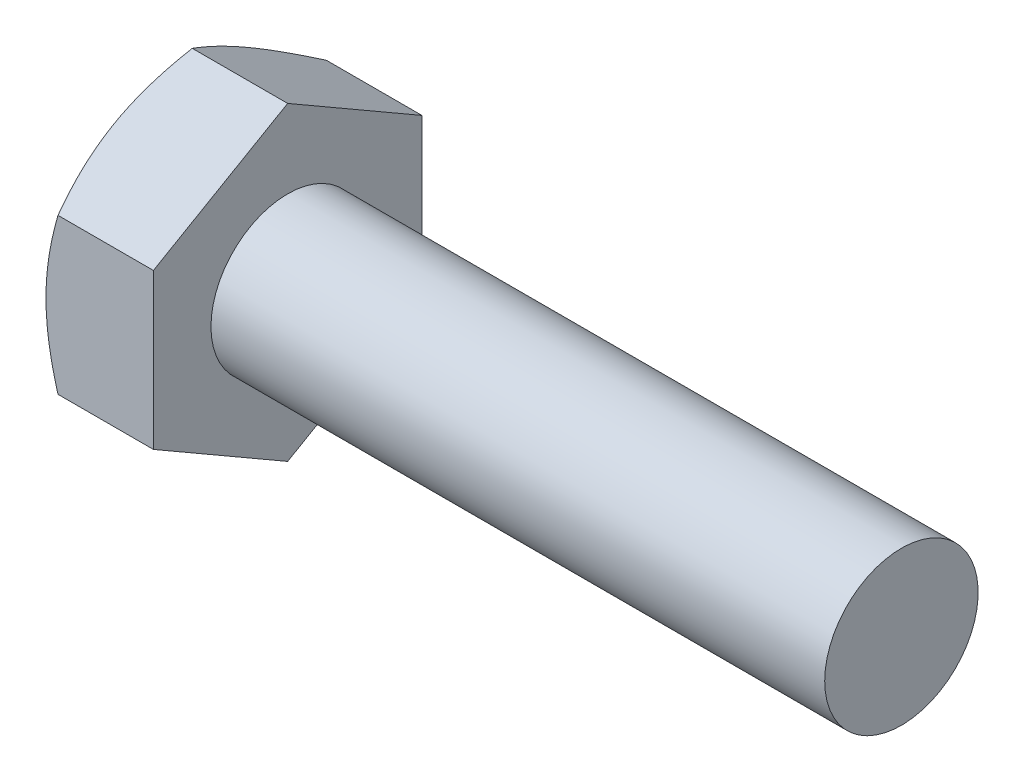
ISO-10303-21;
HEADER;
FILE_DESCRIPTION(('STEP AP214'),'2;1');
FILE_NAME('part.step','',(''),(''),'','','');
FILE_SCHEMA(('AUTOMOTIVE_DESIGN { 1 0 10303 214 1 1 1 1 }'));
ENDSEC;
DATA;
#1=APPLICATION_CONTEXT('core data for automotive mechanical design processes');
#2=APPLICATION_PROTOCOL_DEFINITION('international standard','automotive_design',2000,#1);
#3=PRODUCT_CONTEXT('',#1,'mechanical');
#4=PRODUCT('Part','Part','',(#3));
#5=PRODUCT_RELATED_PRODUCT_CATEGORY('part','',(#4));
#6=PRODUCT_DEFINITION_FORMATION('','',#4);
#7=PRODUCT_DEFINITION_CONTEXT('part definition',#1,'design');
#8=PRODUCT_DEFINITION('design','',#6,#7);
#9=PRODUCT_DEFINITION_SHAPE('','',#8);
#10=(LENGTH_UNIT() NAMED_UNIT(*) SI_UNIT(.MILLI.,.METRE.));
#11=(NAMED_UNIT(*) PLANE_ANGLE_UNIT() SI_UNIT($,.RADIAN.));
#12=(NAMED_UNIT(*) SI_UNIT($,.STERADIAN.) SOLID_ANGLE_UNIT());
#13=UNCERTAINTY_MEASURE_WITH_UNIT(LENGTH_MEASURE(1.E-05),#10,'distance_accuracy_value','');
#14=(GEOMETRIC_REPRESENTATION_CONTEXT(3) GLOBAL_UNCERTAINTY_ASSIGNED_CONTEXT((#13)) GLOBAL_UNIT_ASSIGNED_CONTEXT((#10,
#11,#12)) REPRESENTATION_CONTEXT('',''));
#15=CARTESIAN_POINT('',(0.,0.,0.));
#16=DIRECTION('',(0.,0.,1.));
#17=DIRECTION('',(1.,0.,0.));
#18=AXIS2_PLACEMENT_3D('',#15,#16,#17);
#19=CARTESIAN_POINT('',(2.8,2.02072594216369,-3.5));
#20=DIRECTION('',(0.,-0.866025403784438,0.500000000000001));
#21=DIRECTION('',(0.,-0.500000000000001,-0.866025403784438));
#22=AXIS2_PLACEMENT_3D('',#19,#20,#21);
#23=PLANE('',#22);
#24=CARTESIAN_POINT('',(0.312674060693371,4.04156735438122,0.000200000000000014));
#25=CARTESIAN_POINT('',(0.261385788989984,3.9527667384984,-0.15360717845245));
#26=CARTESIAN_POINT('',(0.214740953816197,3.86319960126198,-0.308742010834424));
#27=CARTESIAN_POINT('',(0.133321875533349,3.68251437287562,-0.621698006576781));
#28=CARTESIAN_POINT('',(0.0985764355845617,3.59139307116725,-0.779524730787495));
#29=CARTESIAN_POINT('',(0.0444900271828363,3.41027974688034,-1.09322221038013));
#30=CARTESIAN_POINT('',(0.0247890862603818,3.32031559103708,-1.24904469916069));
#31=CARTESIAN_POINT('',(0.00127013273725428,3.13996396008052,-1.56142288720537));
#32=CARTESIAN_POINT('',(-0.00256735545443524,3.04957714051106,-1.71797745103423));
#33=CARTESIAN_POINT('',(0.00541530187697692,2.88068384499777,-2.01050921992099));
#34=CARTESIAN_POINT('',(0.0152754340696064,2.80215208834114,-2.14653021245791));
#35=CARTESIAN_POINT('',(0.0465264668994025,2.64560020969753,-2.41768602028899));
#36=CARTESIAN_POINT('',(0.0679280432857969,2.56758062920649,-2.55281989768468));
#37=CARTESIAN_POINT('',(0.121430407880575,2.41070596159678,-2.82453479240518));
#38=CARTESIAN_POINT('',(0.153757994445085,2.33187072981463,-2.96108141927834));
#39=CARTESIAN_POINT('',(0.227128933807992,2.17537608630783,-3.2321380929445));
#40=CARTESIAN_POINT('',(0.268155046569864,2.09771466960098,-3.36665161246854));
#41=CARTESIAN_POINT('',(0.312674060693368,2.02061047210985,-3.5002));
#42=B_SPLINE_CURVE_WITH_KNOTS('',3,(#24,#25,#26,#27,#28,#29,#30,#31,#32,#33,#34,#35,#36,#37,#38,
#39,#40,#41),.UNSPECIFIED.,.F.,.F.,(4,2,2,2,2,2,2,2,4),(0.,0.554793832886254,1.11092123814984,
1.65328467083219,2.19498204478403,2.6666513085086,3.13875761298267,3.6213361260051,
4.10296698719187),.UNSPECIFIED.);
#43=CARTESIAN_POINT('',(0.312607391169643,4.04145188432738,0.));
#44=VERTEX_POINT('',#43);
#45=CARTESIAN_POINT('',(0.,3.03108891324553,-1.75));
#46=VERTEX_POINT('',#45);
#47=EDGE_CURVE('E52',#44,#46,#42,.T.);
#48=ORIENTED_EDGE('',*,*,#47,.F.);
#49=DIRECTION('',(-1.,0.,0.));
#50=VECTOR('',#49,1.);
#51=CARTESIAN_POINT('',(2.8,4.04145188432738,0.));
#52=LINE('',#51,#50);
#53=CARTESIAN_POINT('',(2.8,4.04145188432738,0.));
#54=VERTEX_POINT('',#53);
#55=EDGE_CURVE('E148',#54,#44,#52,.T.);
#56=ORIENTED_EDGE('',*,*,#55,.F.);
#57=DIRECTION('',(0.,0.500000000000001,0.866025403784438));
#58=VECTOR('',#57,1.);
#59=CARTESIAN_POINT('',(2.8,2.02072594216369,-3.5));
#60=LINE('',#59,#58);
#61=CARTESIAN_POINT('',(2.8,2.02072594216369,-3.5));
#62=VERTEX_POINT('',#61);
#63=EDGE_CURVE('E233',#62,#54,#60,.T.);
#64=ORIENTED_EDGE('',*,*,#63,.F.);
#65=DIRECTION('',(-1.,0.,0.));
#66=VECTOR('',#65,1.);
#67=CARTESIAN_POINT('',(2.8,2.02072594216369,-3.5));
#68=LINE('',#67,#66);
#69=CARTESIAN_POINT('',(0.31260739116964,2.02072594216369,-3.5));
#70=VERTEX_POINT('',#69);
#71=EDGE_CURVE('E136',#62,#70,#68,.T.);
#72=ORIENTED_EDGE('',*,*,#71,.T.);
#73=EDGE_CURVE('E130',#46,#70,#42,.T.);
#74=ORIENTED_EDGE('',*,*,#73,.F.);
#75=EDGE_LOOP('',(#48,#56,#64,#72,#74));
#76=FACE_BOUND('',#75,.T.);
#77=ADVANCED_FACE('F36',(#76),#23,.F.);
#78=CARTESIAN_POINT('',(2.8,4.04145188432738,0.));
#79=DIRECTION('',(0.,-0.866025403784438,-0.500000000000001));
#80=DIRECTION('',(0.,0.500000000000001,-0.866025403784438));
#81=AXIS2_PLACEMENT_3D('',#78,#79,#80);
#82=PLANE('',#81);
#83=CARTESIAN_POINT('',(0.312674060693368,2.02061047210985,3.5002));
#84=CARTESIAN_POINT('',(0.261385788989981,2.10941108799267,3.34639282154755));
#85=CARTESIAN_POINT('',(0.214740953816194,2.19897822522909,3.19125798916558));
#86=CARTESIAN_POINT('',(0.133321875533347,2.37966345361545,2.87830199342322));
#87=CARTESIAN_POINT('',(0.0985764355845602,2.47078475532382,2.72047526921251));
#88=CARTESIAN_POINT('',(0.0444900271828353,2.65189807961073,2.40677778961987));
#89=CARTESIAN_POINT('',(0.0247890862603807,2.74186223545399,2.25095530083931));
#90=CARTESIAN_POINT('',(0.00127013273725387,2.92221386641055,1.93857711279463));
#91=CARTESIAN_POINT('',(-0.00256735545443493,3.01260068598001,1.78202254896577));
#92=CARTESIAN_POINT('',(0.00541530187697771,3.1814939814933,1.48949078007901));
#93=CARTESIAN_POINT('',(0.0152754340696071,3.26002573814993,1.3534697875421));
#94=CARTESIAN_POINT('',(0.0465264668994036,3.41657761679354,1.08231397971101));
#95=CARTESIAN_POINT('',(0.0679280432857984,3.49459719728458,0.947180102315318));
#96=CARTESIAN_POINT('',(0.121430407880577,3.65147186489429,0.675465207594817));
#97=CARTESIAN_POINT('',(0.153757994445087,3.73030709667644,0.538918580721665));
#98=CARTESIAN_POINT('',(0.227128933807994,3.88680174018324,0.267861907055499));
#99=CARTESIAN_POINT('',(0.268155046569867,3.96446315689009,0.133348387531464));
#100=CARTESIAN_POINT('',(0.312674060693371,4.04156735438122,-0.000200000000000172));
#101=B_SPLINE_CURVE_WITH_KNOTS('',3,(#83,#84,#85,#86,#87,#88,#89,#90,#91,#92,#93,#94,#95,#96,
#97,#98,#99,#100),.UNSPECIFIED.,.F.,.F.,(4,2,2,2,2,2,2,2,4),(0.,0.554793832886253,
1.11092123814984,1.65328467083219,2.19498204478403,2.6666513085086,3.13875761298267,
3.6213361260051,4.10296698719187),.UNSPECIFIED.);
#102=CARTESIAN_POINT('',(0.31260739116964,2.02072594216369,3.5));
#103=VERTEX_POINT('',#102);
#104=CARTESIAN_POINT('',(0.,3.03108891324553,1.75));
#105=VERTEX_POINT('',#104);
#106=EDGE_CURVE('E59',#103,#105,#101,.T.);
#107=ORIENTED_EDGE('',*,*,#106,.F.);
#108=DIRECTION('',(-1.,0.,0.));
#109=VECTOR('',#108,1.);
#110=CARTESIAN_POINT('',(2.8,2.02072594216369,3.5));
#111=LINE('',#110,#109);
#112=CARTESIAN_POINT('',(2.8,2.02072594216369,3.5));
#113=VERTEX_POINT('',#112);
#114=EDGE_CURVE('E146',#113,#103,#111,.T.);
#115=ORIENTED_EDGE('',*,*,#114,.F.);
#116=DIRECTION('',(0.,-0.500000000000001,0.866025403784438));
#117=VECTOR('',#116,1.);
#118=CARTESIAN_POINT('',(2.8,4.04145188432738,0.));
#119=LINE('',#118,#117);
#120=EDGE_CURVE('E231',#54,#113,#119,.T.);
#121=ORIENTED_EDGE('',*,*,#120,.F.);
#122=ORIENTED_EDGE('',*,*,#55,.T.);
#123=EDGE_CURVE('E163',#105,#44,#101,.T.);
#124=ORIENTED_EDGE('',*,*,#123,.F.);
#125=EDGE_LOOP('',(#107,#115,#121,#122,#124));
#126=FACE_BOUND('',#125,.T.);
#127=ADVANCED_FACE('F169',(#126),#82,.F.);
#128=CARTESIAN_POINT('',(2.8,2.02072594216369,3.5));
#129=DIRECTION('',(0.,0.,-1.));
#130=DIRECTION('',(0.,1.,0.));
#131=AXIS2_PLACEMENT_3D('',#128,#129,#130);
#132=PLANE('',#131);
#133=CARTESIAN_POINT('',(1.74876972324083,-5.51155991662166,3.5));
#134=CARTESIAN_POINT('',(1.67392336064349,-5.35795146497442,3.5));
#135=CARTESIAN_POINT('',(1.59977092634846,-5.20399921327066,3.5));
#136=CARTESIAN_POINT('',(1.45324265223557,-4.89522455167778,3.5));
#137=CARTESIAN_POINT('',(1.38086707701141,-4.74040201636207,3.5));
#138=CARTESIAN_POINT('',(1.23793493399994,-4.42894615294238,3.5));
#139=CARTESIAN_POINT('',(1.16738971193149,-4.27230760071021,3.5));
#140=CARTESIAN_POINT('',(1.02907715201446,-3.95781335407224,3.5));
#141=CARTESIAN_POINT('',(0.961309688205795,-3.79995771524289,3.5));
#142=CARTESIAN_POINT('',(0.82704925806826,-3.47741113342679,3.5));
#143=CARTESIAN_POINT('',(0.760677040301388,-3.31266966191409,3.5));
#144=CARTESIAN_POINT('',(0.632756391222596,-2.9812905533435,3.5));
#145=CARTESIAN_POINT('',(0.571208489240966,-2.81465271050396,3.5));
#146=CARTESIAN_POINT('',(0.454490935593627,-2.47950135142083,3.5));
#147=CARTESIAN_POINT('',(0.399309072522244,-2.31099212961238,3.5));
#148=CARTESIAN_POINT('',(0.297038623207365,-1.97155788075462,3.5));
#149=CARTESIAN_POINT('',(0.24994757546108,-1.80063360563482,3.5));
#150=CARTESIAN_POINT('',(0.166312731904444,-1.4572176944235,3.5));
#151=CARTESIAN_POINT('',(0.129709932809728,-1.2847406913243,3.5));
#152=CARTESIAN_POINT('',(0.0690664437905964,-0.937557024710308,3.5));
#153=CARTESIAN_POINT('',(0.0450243877823819,-0.762850605780832,3.5));
#154=CARTESIAN_POINT('',(0.0117307990577601,-0.414396255839315,3.5));
#155=CARTESIAN_POINT('',(0.00228260576824184,-0.240667591359053,3.5));
#156=CARTESIAN_POINT('',(-0.00154556657178785,0.106974361978124,3.5));
#157=CARTESIAN_POINT('',(0.00407467653682711,0.280887653519271,3.5));
#158=CARTESIAN_POINT('',(0.0258160056757244,0.573677732069631,3.5));
#159=CARTESIAN_POINT('',(0.0381294865222875,0.692856455403483,3.5));
#160=CARTESIAN_POINT('',(0.0691104276210837,0.930390572672188,3.5));
#161=CARTESIAN_POINT('',(0.0877786805228844,1.04874586201749,3.5));
#162=CARTESIAN_POINT('',(0.152339395828374,1.40238821330866,3.5));
#163=CARTESIAN_POINT('',(0.206777964761844,1.63613518289363,3.5));
#164=CARTESIAN_POINT('',(0.301818253779738,1.98584040996061,3.5));
#165=CARTESIAN_POINT('',(0.336200478121237,2.10359260845123,3.5));
#166=CARTESIAN_POINT('',(0.408694226179533,2.33795453185626,3.5));
#167=CARTESIAN_POINT('',(0.446805778664191,2.45456424794998,3.5));
#168=CARTESIAN_POINT('',(0.526133501179596,2.68667648799219,3.5));
#169=CARTESIAN_POINT('',(0.567348797905205,2.80217931315366,3.5));
#170=CARTESIAN_POINT('',(0.652383319257558,3.03221622488003,3.5));
#171=CARTESIAN_POINT('',(0.696202484064565,3.14675033363066,3.5));
#172=CARTESIAN_POINT('',(0.817586420524255,3.45518824791986,3.5));
#173=CARTESIAN_POINT('',(0.897216284270027,3.64827858653488,3.5));
#174=CARTESIAN_POINT('',(1.06116121789353,4.03246734047174,3.5));
#175=CARTESIAN_POINT('',(1.14547680977311,4.22356553103577,3.5));
#176=CARTESIAN_POINT('',(1.31768022516433,4.60422080385888,3.5));
#177=CARTESIAN_POINT('',(1.40556928969842,4.79377732281037,3.5));
#178=CARTESIAN_POINT('',(1.5840729434937,5.17160543290686,3.5));
#179=CARTESIAN_POINT('',(1.67468761675268,5.3598769842319,3.5));
#180=CARTESIAN_POINT('',(1.85818750995008,5.73567568482784,3.5));
#181=CARTESIAN_POINT('',(1.95107608308063,5.92320119337957,3.5));
#182=CARTESIAN_POINT('',(2.13854805180964,6.29740401627919,3.5));
#183=CARTESIAN_POINT('',(2.23313146548459,6.48408132155384,3.5));
#184=CARTESIAN_POINT('',(2.51886265052555,7.04299370869452,3.5));
#185=CARTESIAN_POINT('',(2.71203324279836,7.41419418882236,3.5));
#186=CARTESIAN_POINT('',(3.08131090922904,8.11545297659332,3.5));
#187=CARTESIAN_POINT('',(3.257056800529,8.44570240889787,3.5));
#188=CARTESIAN_POINT('',(3.61066708174042,9.10509095555402,3.5));
#189=CARTESIAN_POINT('',(3.78853160254258,9.43422999967597,3.5));
#190=CARTESIAN_POINT('',(4.14522643287858,10.0905480477554,3.5));
#191=CARTESIAN_POINT('',(4.32405147354835,10.4177299197431,3.5));
#192=CARTESIAN_POINT('',(4.68290305461308,11.0714005829853,3.5));
#193=CARTESIAN_POINT('',(4.86292949853349,11.3978894271807,3.5));
#194=CARTESIAN_POINT('',(5.04339321876768,11.7241348746726,3.5));
#195=B_SPLINE_CURVE_WITH_KNOTS('',3,(#133,#134,#135,#136,#137,#138,#139,#140,#141,#142,#143,
#144,#145,#146,#147,#148,#149,#150,#151,#152,#153,#154,#155,#156,#157,#158,#159,#160,#161,#162,
#163,#164,#165,#166,#167,#168,#169,#170,#171,#172,#173,#174,#175,#176,#177,#178,#179,#180,#181,
#182,#183,#184,#185,#186,#187,#188,#189,#190,#191,#192,#193,#194),.UNSPECIFIED.,.F.,.F.,(4,2,2,
2,2,2,2,2,2,2,2,2,2,2,2,2,2,2,2,2,2,2,2,2,2,2,2,2,2,2,4),(0.,0.512624455455558,1.02532478887103,
1.54067716699584,2.05600615007007,2.58877526866933,3.12160276180877,3.65339055960882,
4.18501628177853,4.71358975001966,5.24210571958898,5.76343550668358,6.28477297996432,
6.64403977825952,7.00335140539848,7.72232402673615,8.09029790450666,8.45827462103385,
8.82614818350625,9.19401329793224,9.82051720822946,10.4470910530887,11.0738843896344,
11.7006970625238,12.3284975533834,12.9563047441025,14.211635085947,15.33392926628,
16.4562931462709,17.574877685398,18.6933734561263),.UNSPECIFIED.);
#196=CARTESIAN_POINT('',(0.31260739116964,-2.02072594216368,3.5));
#197=VERTEX_POINT('',#196);
#198=CARTESIAN_POINT('',(0.,0.,3.5));
#199=VERTEX_POINT('',#198);
#200=EDGE_CURVE('E240',#197,#199,#195,.T.);
#201=ORIENTED_EDGE('',*,*,#200,.F.);
#202=DIRECTION('',(-1.,0.,0.));
#203=VECTOR('',#202,1.);
#204=CARTESIAN_POINT('',(2.8,-2.02072594216368,3.5));
#205=LINE('',#204,#203);
#206=CARTESIAN_POINT('',(2.8,-2.02072594216368,3.5));
#207=VERTEX_POINT('',#206);
#208=EDGE_CURVE('E138',#207,#197,#205,.T.);
#209=ORIENTED_EDGE('',*,*,#208,.F.);
#210=DIRECTION('',(0.,-1.,0.));
#211=VECTOR('',#210,1.);
#212=CARTESIAN_POINT('',(2.8,2.02072594216369,3.5));
#213=LINE('',#212,#211);
#214=EDGE_CURVE('E227',#113,#207,#213,.T.);
#215=ORIENTED_EDGE('',*,*,#214,.F.);
#216=ORIENTED_EDGE('',*,*,#114,.T.);
#217=EDGE_CURVE('E185',#199,#103,#195,.T.);
#218=ORIENTED_EDGE('',*,*,#217,.F.);
#219=EDGE_LOOP('',(#201,#209,#215,#216,#218));
#220=FACE_BOUND('',#219,.T.);
#221=ADVANCED_FACE('F246',(#220),#132,.F.);
#222=CARTESIAN_POINT('',(2.8,-4.04145188432739,0.));
#223=DIRECTION('',(0.,0.866025403784438,-0.500000000000002));
#224=DIRECTION('',(0.,0.500000000000002,0.866025403784438));
#225=AXIS2_PLACEMENT_3D('',#222,#223,#224);
#226=PLANE('',#225);
#227=CARTESIAN_POINT('',(0.312674060693372,-4.04156735438122,-0.000200000000000053));
#228=CARTESIAN_POINT('',(0.261385788989984,-3.9527667384984,0.153607178452449));
#229=CARTESIAN_POINT('',(0.214740953816198,-3.86319960126198,0.308742010834424));
#230=CARTESIAN_POINT('',(0.13332187553335,-3.68251437287563,0.621698006576781));
#231=CARTESIAN_POINT('',(0.0985764355845624,-3.59139307116725,0.779524730787495));
#232=CARTESIAN_POINT('',(0.0444900271828367,-3.41027974688034,1.09322221038013));
#233=CARTESIAN_POINT('',(0.0247890862603818,-3.32031559103708,1.24904469916069));
#234=CARTESIAN_POINT('',(0.00127013273725418,-3.13996396008052,1.56142288720537));
#235=CARTESIAN_POINT('',(-0.00256735545443503,-3.04957714051106,1.71797745103423));
#236=CARTESIAN_POINT('',(0.00541530187697697,-2.88068384499777,2.01050921992099));
#237=CARTESIAN_POINT('',(0.0152754340696061,-2.80215208834114,2.14653021245791));
#238=CARTESIAN_POINT('',(0.0465264668994021,-2.64560020969753,2.41768602028899));
#239=CARTESIAN_POINT('',(0.0679280432857966,-2.56758062920649,2.55281989768468));
#240=CARTESIAN_POINT('',(0.121430407880575,-2.41070596159678,2.82453479240518));
#241=CARTESIAN_POINT('',(0.153757994445085,-2.33187072981463,2.96108141927834));
#242=CARTESIAN_POINT('',(0.227128933807991,-2.17537608630782,3.2321380929445));
#243=CARTESIAN_POINT('',(0.268155046569864,-2.09771466960098,3.36665161246854));
#244=CARTESIAN_POINT('',(0.312674060693368,-2.02061047210985,3.5002));
#245=B_SPLINE_CURVE_WITH_KNOTS('',3,(#227,#228,#229,#230,#231,#232,#233,#234,#235,#236,#237,
#238,#239,#240,#241,#242,#243,#244),.UNSPECIFIED.,.F.,.F.,(4,2,2,2,2,2,2,2,4),(0.,
0.554793832886254,1.11092123814984,1.65328467083219,2.19498204478403,2.6666513085086,
3.13875761298268,3.6213361260051,4.10296698719188),.UNSPECIFIED.);
#246=CARTESIAN_POINT('',(0.312607391169644,-4.04145188432739,0.));
#247=VERTEX_POINT('',#246);
#248=CARTESIAN_POINT('',(0.,-3.03108891324553,1.75000000000001));
#249=VERTEX_POINT('',#248);
#250=EDGE_CURVE('E171',#247,#249,#245,.T.);
#251=ORIENTED_EDGE('',*,*,#250,.F.);
#252=DIRECTION('',(-1.,0.,0.));
#253=VECTOR('',#252,1.);
#254=CARTESIAN_POINT('',(2.8,-4.04145188432739,0.));
#255=LINE('',#254,#253);
#256=CARTESIAN_POINT('',(2.8,-4.04145188432739,0.));
#257=VERTEX_POINT('',#256);
#258=EDGE_CURVE('E135',#257,#247,#255,.T.);
#259=ORIENTED_EDGE('',*,*,#258,.F.);
#260=DIRECTION('',(0.,-0.500000000000002,-0.866025403784437));
#261=VECTOR('',#260,1.);
#262=CARTESIAN_POINT('',(2.8,-4.04145188432739,0.));
#263=LINE('',#262,#261);
#264=EDGE_CURVE('E225',#207,#257,#263,.T.);
#265=ORIENTED_EDGE('',*,*,#264,.F.);
#266=ORIENTED_EDGE('',*,*,#208,.T.);
#267=EDGE_CURVE('E173',#249,#197,#245,.T.);
#268=ORIENTED_EDGE('',*,*,#267,.F.);
#269=EDGE_LOOP('',(#251,#259,#265,#266,#268));
#270=FACE_BOUND('',#269,.T.);
#271=ADVANCED_FACE('F221',(#270),#226,.F.);
#272=CARTESIAN_POINT('',(2.8,-2.02072594216369,-3.5));
#273=DIRECTION('',(0.,0.866025403784438,0.5));
#274=DIRECTION('',(0.,-0.5,0.866025403784439));
#275=AXIS2_PLACEMENT_3D('',#272,#273,#274);
#276=PLANE('',#275);
#277=CARTESIAN_POINT('',(0.312674060693371,-2.02061047210986,-3.5002));
#278=CARTESIAN_POINT('',(0.261385788989983,-2.10941108799267,-3.34639282154755));
#279=CARTESIAN_POINT('',(0.214740953816197,-2.1989782252291,-3.19125798916558));
#280=CARTESIAN_POINT('',(0.133321875533349,-2.37966345361545,-2.87830199342322));
#281=CARTESIAN_POINT('',(0.0985764355845624,-2.47078475532383,-2.7204752692125));
#282=CARTESIAN_POINT('',(0.0444900271828375,-2.65189807961074,-2.40677778961987));
#283=CARTESIAN_POINT('',(0.0247890862603829,-2.741862235454,-2.25095530083931));
#284=CARTESIAN_POINT('',(0.00127013273725596,-2.92221386641056,-1.93857711279463));
#285=CARTESIAN_POINT('',(-0.00256735545443294,-3.01260068598002,-1.78202254896577));
#286=CARTESIAN_POINT('',(0.00541530187697972,-3.1814939814933,-1.48949078007901));
#287=CARTESIAN_POINT('',(0.0152754340696092,-3.26002573814993,-1.35346978754209));
#288=CARTESIAN_POINT('',(0.0465264668994055,-3.41657761679354,-1.08231397971101));
#289=CARTESIAN_POINT('',(0.0679280432858001,-3.49459719728458,-0.947180102315317));
#290=CARTESIAN_POINT('',(0.121430407880579,-3.65147186489429,-0.675465207594816));
#291=CARTESIAN_POINT('',(0.153757994445089,-3.73030709667644,-0.538918580721665));
#292=CARTESIAN_POINT('',(0.227128933807996,-3.88680174018325,-0.267861907055498));
#293=CARTESIAN_POINT('',(0.268155046569868,-3.96446315689009,-0.133348387531463));
#294=CARTESIAN_POINT('',(0.312674060693372,-4.04156735438122,0.000199999999999962));
#295=B_SPLINE_CURVE_WITH_KNOTS('',3,(#277,#278,#279,#280,#281,#282,#283,#284,#285,#286,#287,
#288,#289,#290,#291,#292,#293,#294),.UNSPECIFIED.,.F.,.F.,(4,2,2,2,2,2,2,2,4),(0.,
0.554793832886254,1.11092123814984,1.65328467083219,2.19498204478403,2.6666513085086,
3.13875761298267,3.6213361260051,4.10296698719187),.UNSPECIFIED.);
#296=CARTESIAN_POINT('',(0.312607391169535,-2.02072594216386,-3.5));
#297=VERTEX_POINT('',#296);
#298=CARTESIAN_POINT('',(0.,-3.03108891324553,-1.75));
#299=VERTEX_POINT('',#298);
#300=EDGE_CURVE('E112',#297,#299,#295,.T.);
#301=ORIENTED_EDGE('',*,*,#300,.F.);
#302=DIRECTION('',(-1.,0.,0.));
#303=VECTOR('',#302,1.);
#304=CARTESIAN_POINT('',(2.8,-2.02072594216369,-3.5));
#305=LINE('',#304,#303);
#306=CARTESIAN_POINT('',(2.8,-2.02072594216369,-3.5));
#307=VERTEX_POINT('',#306);
#308=EDGE_CURVE('E126',#307,#297,#305,.T.);
#309=ORIENTED_EDGE('',*,*,#308,.F.);
#310=DIRECTION('',(0.,0.5,-0.866025403784439));
#311=VECTOR('',#310,1.);
#312=CARTESIAN_POINT('',(2.8,-2.02072594216369,-3.5));
#313=LINE('',#312,#311);
#314=EDGE_CURVE('E223',#257,#307,#313,.T.);
#315=ORIENTED_EDGE('',*,*,#314,.F.);
#316=ORIENTED_EDGE('',*,*,#258,.T.);
#317=EDGE_CURVE('E129',#299,#247,#295,.T.);
#318=ORIENTED_EDGE('',*,*,#317,.F.);
#319=EDGE_LOOP('',(#301,#309,#315,#316,#318));
#320=FACE_BOUND('',#319,.T.);
#321=ADVANCED_FACE('F124',(#320),#276,.F.);
#322=CARTESIAN_POINT('',(2.8,2.02072594216369,-3.5));
#323=DIRECTION('',(0.,0.,1.));
#324=DIRECTION('',(0.,-1.,0.));
#325=AXIS2_PLACEMENT_3D('',#322,#323,#324);
#326=PLANE('',#325);
#327=CARTESIAN_POINT('',(1.74876972324083,-5.51155991662167,-3.5));
#328=CARTESIAN_POINT('',(1.6739233606435,-5.35795146497443,-3.5));
#329=CARTESIAN_POINT('',(1.59977092634847,-5.20399921327067,-3.5));
#330=CARTESIAN_POINT('',(1.45324265223558,-4.89522455167779,-3.5));
#331=CARTESIAN_POINT('',(1.38086707701141,-4.74040201636208,-3.5));
#332=CARTESIAN_POINT('',(1.23793493399994,-4.42894615294239,-3.5));
#333=CARTESIAN_POINT('',(1.1673897119315,-4.27230760071022,-3.5));
#334=CARTESIAN_POINT('',(1.02907715201446,-3.95781335407225,-3.5));
#335=CARTESIAN_POINT('',(0.961309688205799,-3.7999577152429,-3.5));
#336=CARTESIAN_POINT('',(0.827049258068263,-3.4774111334268,-3.5));
#337=CARTESIAN_POINT('',(0.760677040301391,-3.3126696619141,-3.5));
#338=CARTESIAN_POINT('',(0.632756391222599,-2.98129055334351,-3.5));
#339=CARTESIAN_POINT('',(0.571208489240969,-2.81465271050397,-3.5));
#340=CARTESIAN_POINT('',(0.454490935593631,-2.47950135142084,-3.5));
#341=CARTESIAN_POINT('',(0.399309072522247,-2.31099212961239,-3.5));
#342=CARTESIAN_POINT('',(0.297038623207367,-1.97155788075463,-3.5));
#343=CARTESIAN_POINT('',(0.249947575461083,-1.80063360563483,-3.5));
#344=CARTESIAN_POINT('',(0.166312731904446,-1.45721769442351,-3.5));
#345=CARTESIAN_POINT('',(0.12970993280973,-1.28474069132431,-3.5));
#346=CARTESIAN_POINT('',(0.0690664437905975,-0.937557024710316,-3.5));
#347=CARTESIAN_POINT('',(0.0450243877823828,-0.76285060578084,-3.5));
#348=CARTESIAN_POINT('',(0.0117307990577606,-0.414396255839323,-3.5));
#349=CARTESIAN_POINT('',(0.00228260576824226,-0.240667591359061,-3.5));
#350=CARTESIAN_POINT('',(-0.0015455665717878,0.106974361978117,-3.5));
#351=CARTESIAN_POINT('',(0.00407467653682687,0.280887653519264,-3.5));
#352=CARTESIAN_POINT('',(0.0258160056757238,0.573677732069624,-3.5));
#353=CARTESIAN_POINT('',(0.0381294865222867,0.692856455403476,-3.5));
#354=CARTESIAN_POINT('',(0.0691104276210827,0.930390572672181,-3.5));
#355=CARTESIAN_POINT('',(0.0877786805228831,1.04874586201748,-3.5));
#356=CARTESIAN_POINT('',(0.152339395828372,1.40238821330865,-3.5));
#357=CARTESIAN_POINT('',(0.206777964761842,1.63613518289362,-3.5));
#358=CARTESIAN_POINT('',(0.301818253779736,1.9858404099606,-3.5));
#359=CARTESIAN_POINT('',(0.336200478121234,2.10359260845122,-3.5));
#360=CARTESIAN_POINT('',(0.40869422617953,2.33795453185625,-3.5));
#361=CARTESIAN_POINT('',(0.446805778664187,2.45456424794997,-3.5));
#362=CARTESIAN_POINT('',(0.526133501179592,2.68667648799218,-3.5));
#363=CARTESIAN_POINT('',(0.567348797905201,2.80217931315364,-3.5));
#364=CARTESIAN_POINT('',(0.652383319257554,3.03221622488002,-3.5));
#365=CARTESIAN_POINT('',(0.696202484064561,3.14675033363065,-3.5));
#366=CARTESIAN_POINT('',(0.817586420524252,3.45518824791985,-3.5));
#367=CARTESIAN_POINT('',(0.897216284270024,3.64827858653487,-3.5));
#368=CARTESIAN_POINT('',(1.06116121789352,4.03246734047173,-3.5));
#369=CARTESIAN_POINT('',(1.1454768097731,4.22356553103576,-3.5));
#370=CARTESIAN_POINT('',(1.31768022516432,4.60422080385887,-3.5));
#371=CARTESIAN_POINT('',(1.40556928969841,4.79377732281036,-3.5));
#372=CARTESIAN_POINT('',(1.58407294349369,5.17160543290685,-3.5));
#373=CARTESIAN_POINT('',(1.67468761675268,5.35987698423189,-3.5));
#374=CARTESIAN_POINT('',(1.85818750995007,5.73567568482784,-3.5));
#375=CARTESIAN_POINT('',(1.95107608308063,5.92320119337956,-3.5));
#376=CARTESIAN_POINT('',(2.13854805180964,6.29740401627918,-3.5));
#377=CARTESIAN_POINT('',(2.23313146548459,6.48408132155384,-3.5));
#378=CARTESIAN_POINT('',(2.51886265052555,7.04299370869451,-3.5));
#379=CARTESIAN_POINT('',(2.71203324279836,7.41419418882235,-3.5));
#380=CARTESIAN_POINT('',(3.08131090922903,8.11545297659331,-3.5));
#381=CARTESIAN_POINT('',(3.257056800529,8.44570240889787,-3.5));
#382=CARTESIAN_POINT('',(3.61066708174042,9.10509095555402,-3.5));
#383=CARTESIAN_POINT('',(3.78853160254258,9.43422999967597,-3.5));
#384=CARTESIAN_POINT('',(4.14522643287858,10.0905480477554,-3.5));
#385=CARTESIAN_POINT('',(4.32405147354835,10.4177299197431,-3.5));
#386=CARTESIAN_POINT('',(4.68290305461308,11.0714005829853,-3.5));
#387=CARTESIAN_POINT('',(4.86292949853349,11.3978894271807,-3.5));
#388=CARTESIAN_POINT('',(5.04339321876768,11.7241348746726,-3.5));
#389=B_SPLINE_CURVE_WITH_KNOTS('',3,(#327,#328,#329,#330,#331,#332,#333,#334,#335,#336,#337,
#338,#339,#340,#341,#342,#343,#344,#345,#346,#347,#348,#349,#350,#351,#352,#353,#354,#355,#356,
#357,#358,#359,#360,#361,#362,#363,#364,#365,#366,#367,#368,#369,#370,#371,#372,#373,#374,#375,
#376,#377,#378,#379,#380,#381,#382,#383,#384,#385,#386,#387,#388),.UNSPECIFIED.,.F.,.F.,(4,2,2,
2,2,2,2,2,2,2,2,2,2,2,2,2,2,2,2,2,2,2,2,2,2,2,2,2,2,2,4),(0.,0.512624455455559,1.02532478887103,
1.54067716699585,2.05600615007008,2.58877526866933,3.12160276180877,3.65339055960882,
4.18501628177853,4.71358975001967,5.24210571958899,5.76343550668359,6.28477297996433,
6.64403977825953,7.00335140539848,7.72232402673616,8.09029790450666,8.45827462103385,
8.82614818350625,9.19401329793224,9.82051720822946,10.4470910530887,11.0738843896344,
11.7006970625238,12.3284975533834,12.9563047441025,14.211635085947,15.3339292662801,
16.4562931462709,17.574877685398,18.6933734561263),.UNSPECIFIED.);
#390=CARTESIAN_POINT('',(0.,0.,-3.5));
#391=VERTEX_POINT('',#390);
#392=EDGE_CURVE('E118',#70,#391,#389,.F.);
#393=ORIENTED_EDGE('',*,*,#392,.F.);
#394=ORIENTED_EDGE('',*,*,#71,.F.);
#395=DIRECTION('',(0.,1.,0.));
#396=VECTOR('',#395,1.);
#397=CARTESIAN_POINT('',(2.8,2.02072594216369,-3.5));
#398=LINE('',#397,#396);
#399=EDGE_CURVE('E134',#307,#62,#398,.T.);
#400=ORIENTED_EDGE('',*,*,#399,.F.);
#401=ORIENTED_EDGE('',*,*,#308,.T.);
#402=EDGE_CURVE('E109',#391,#297,#389,.F.);
#403=ORIENTED_EDGE('',*,*,#402,.F.);
#404=EDGE_LOOP('',(#393,#394,#400,#401,#403));
#405=FACE_BOUND('',#404,.T.);
#406=ADVANCED_FACE('F132',(#405),#326,.F.);
#407=CARTESIAN_POINT('',(2.8,4.04145188432738,0.));
#408=DIRECTION('',(1.,0.,0.));
#409=DIRECTION('',(0.,0.,-1.));
#410=AXIS2_PLACEMENT_3D('',#407,#408,#409);
#411=PLANE('',#410);
#412=CARTESIAN_POINT('',(2.8,0.,0.));
#413=DIRECTION('',(1.,0.,0.));
#414=DIRECTION('',(0.,0.,-1.));
#415=AXIS2_PLACEMENT_3D('',#412,#413,#414);
#416=CIRCLE('',#415,2.);
#417=CARTESIAN_POINT('',(2.8,0.,-2.));
#418=VERTEX_POINT('',#417);
#419=EDGE_CURVE('E236',#418,#418,#416,.F.);
#420=ORIENTED_EDGE('',*,*,#419,.T.);
#421=EDGE_LOOP('',(#420));
#422=FACE_BOUND('',#421,.T.);
#423=ORIENTED_EDGE('',*,*,#63,.T.);
#424=ORIENTED_EDGE('',*,*,#120,.T.);
#425=ORIENTED_EDGE('',*,*,#214,.T.);
#426=ORIENTED_EDGE('',*,*,#264,.T.);
#427=ORIENTED_EDGE('',*,*,#314,.T.);
#428=ORIENTED_EDGE('',*,*,#399,.T.);
#429=EDGE_LOOP('',(#423,#424,#425,#426,#427,#428));
#430=FACE_BOUND('',#429,.T.);
#431=ADVANCED_FACE('F248',(#422,#430),#411,.T.);
#432=CARTESIAN_POINT('',(0.,0.,0.));
#433=DIRECTION('',(-1.,0.,0.));
#434=DIRECTION('',(0.,0.,1.));
#435=AXIS2_PLACEMENT_3D('',#432,#433,#434);
#436=CYLINDRICAL_SURFACE('',#435,2.);
#437=ORIENTED_EDGE('',*,*,#419,.F.);
#438=EDGE_LOOP('',(#437));
#439=FACE_BOUND('',#438,.T.);
#440=CARTESIAN_POINT('',(18.8,0.,0.));
#441=DIRECTION('',(-1.,0.,0.));
#442=DIRECTION('',(0.,0.,1.));
#443=AXIS2_PLACEMENT_3D('',#440,#441,#442);
#444=CIRCLE('',#443,2.);
#445=CARTESIAN_POINT('',(18.8,0.,2.));
#446=VERTEX_POINT('',#445);
#447=EDGE_CURVE('E238',#446,#446,#444,.T.);
#448=ORIENTED_EDGE('',*,*,#447,.T.);
#449=EDGE_LOOP('',(#448));
#450=FACE_BOUND('',#449,.T.);
#451=ADVANCED_FACE('F278',(#439,#450),#436,.T.);
#452=CARTESIAN_POINT('',(18.8,0.,0.));
#453=DIRECTION('',(-1.,0.,0.));
#454=DIRECTION('',(0.,0.,1.));
#455=AXIS2_PLACEMENT_3D('',#452,#453,#454);
#456=PLANE('',#455);
#457=ORIENTED_EDGE('',*,*,#447,.F.);
#458=EDGE_LOOP('',(#457));
#459=FACE_BOUND('',#458,.T.);
#460=ADVANCED_FACE('F198',(#459),#456,.F.);
#461=CARTESIAN_POINT('',(0.,0.,0.));
#462=DIRECTION('',(1.,0.,0.));
#463=DIRECTION('',(0.,0.,-1.));
#464=AXIS2_PLACEMENT_3D('',#461,#462,#463);
#465=CONICAL_SURFACE('',#464,3.5,1.0471975511966);
#466=ORIENTED_EDGE('',*,*,#300,.T.);
#467=CARTESIAN_POINT('',(0.,0.,0.));
#468=DIRECTION('',(1.,0.,0.));
#469=DIRECTION('',(0.,0.,-1.));
#470=AXIS2_PLACEMENT_3D('',#467,#468,#469);
#471=CIRCLE('',#470,3.5);
#472=EDGE_CURVE('E40',#299,#391,#471,.T.);
#473=ORIENTED_EDGE('',*,*,#472,.T.);
#474=ORIENTED_EDGE('',*,*,#402,.T.);
#475=EDGE_LOOP('',(#466,#473,#474));
#476=FACE_BOUND('',#475,.T.);
#477=ADVANCED_FACE('F111',(#476),#465,.T.);
#478=ORIENTED_EDGE('',*,*,#250,.T.);
#479=EDGE_CURVE('E153',#249,#299,#471,.T.);
#480=ORIENTED_EDGE('',*,*,#479,.T.);
#481=ORIENTED_EDGE('',*,*,#317,.T.);
#482=EDGE_LOOP('',(#478,#480,#481));
#483=FACE_BOUND('',#482,.T.);
#484=ADVANCED_FACE('F197',(#483),#465,.T.);
#485=ORIENTED_EDGE('',*,*,#200,.T.);
#486=EDGE_CURVE('E154',#199,#249,#471,.T.);
#487=ORIENTED_EDGE('',*,*,#486,.T.);
#488=ORIENTED_EDGE('',*,*,#267,.T.);
#489=EDGE_LOOP('',(#485,#487,#488));
#490=FACE_BOUND('',#489,.T.);
#491=ADVANCED_FACE('F192',(#490),#465,.T.);
#492=ORIENTED_EDGE('',*,*,#217,.T.);
#493=ORIENTED_EDGE('',*,*,#106,.T.);
#494=CARTESIAN_POINT('',(0.,0.,0.));
#495=DIRECTION('',(-1.,0.,0.));
#496=DIRECTION('',(0.,0.,1.));
#497=AXIS2_PLACEMENT_3D('',#494,#495,#496);
#498=CIRCLE('',#497,3.5);
#499=EDGE_CURVE('E119',#199,#105,#498,.T.);
#500=ORIENTED_EDGE('',*,*,#499,.F.);
#501=EDGE_LOOP('',(#492,#493,#500));
#502=FACE_BOUND('',#501,.T.);
#503=ADVANCED_FACE('F196',(#502),#465,.T.);
#504=ORIENTED_EDGE('',*,*,#123,.T.);
#505=ORIENTED_EDGE('',*,*,#47,.T.);
#506=EDGE_CURVE('E45',#46,#105,#471,.T.);
#507=ORIENTED_EDGE('',*,*,#506,.T.);
#508=EDGE_LOOP('',(#504,#505,#507));
#509=FACE_BOUND('',#508,.T.);
#510=ADVANCED_FACE('F162',(#509),#465,.T.);
#511=ORIENTED_EDGE('',*,*,#73,.T.);
#512=ORIENTED_EDGE('',*,*,#392,.T.);
#513=EDGE_CURVE('E11',#391,#46,#471,.T.);
#514=ORIENTED_EDGE('',*,*,#513,.T.);
#515=EDGE_LOOP('',(#511,#512,#514));
#516=FACE_BOUND('',#515,.T.);
#517=ADVANCED_FACE('F251',(#516),#465,.T.);
#518=CARTESIAN_POINT('',(0.,4.04145188432738,0.));
#519=DIRECTION('',(1.,0.,0.));
#520=DIRECTION('',(0.,0.,-1.));
#521=AXIS2_PLACEMENT_3D('',#518,#519,#520);
#522=PLANE('',#521);
#523=ORIENTED_EDGE('',*,*,#513,.F.);
#524=ORIENTED_EDGE('',*,*,#472,.F.);
#525=ORIENTED_EDGE('',*,*,#479,.F.);
#526=ORIENTED_EDGE('',*,*,#486,.F.);
#527=ORIENTED_EDGE('',*,*,#499,.T.);
#528=ORIENTED_EDGE('',*,*,#506,.F.);
#529=EDGE_LOOP('',(#523,#524,#525,#526,#527,#528));
#530=FACE_BOUND('',#529,.T.);
#531=ADVANCED_FACE('F166',(#530),#522,.F.);
#532=CLOSED_SHELL('',(#77,#127,#221,#271,#321,#406,#431,#451,#460,#477,#484,#491,#503,#510,#517,#531));
#533=MANIFOLD_SOLID_BREP('B2',#532);
#534=ADVANCED_BREP_SHAPE_REPRESENTATION('',(#18,#533),#14);
#535=SHAPE_DEFINITION_REPRESENTATION(#9,#534);
ENDSEC;
END-ISO-10303-21;
